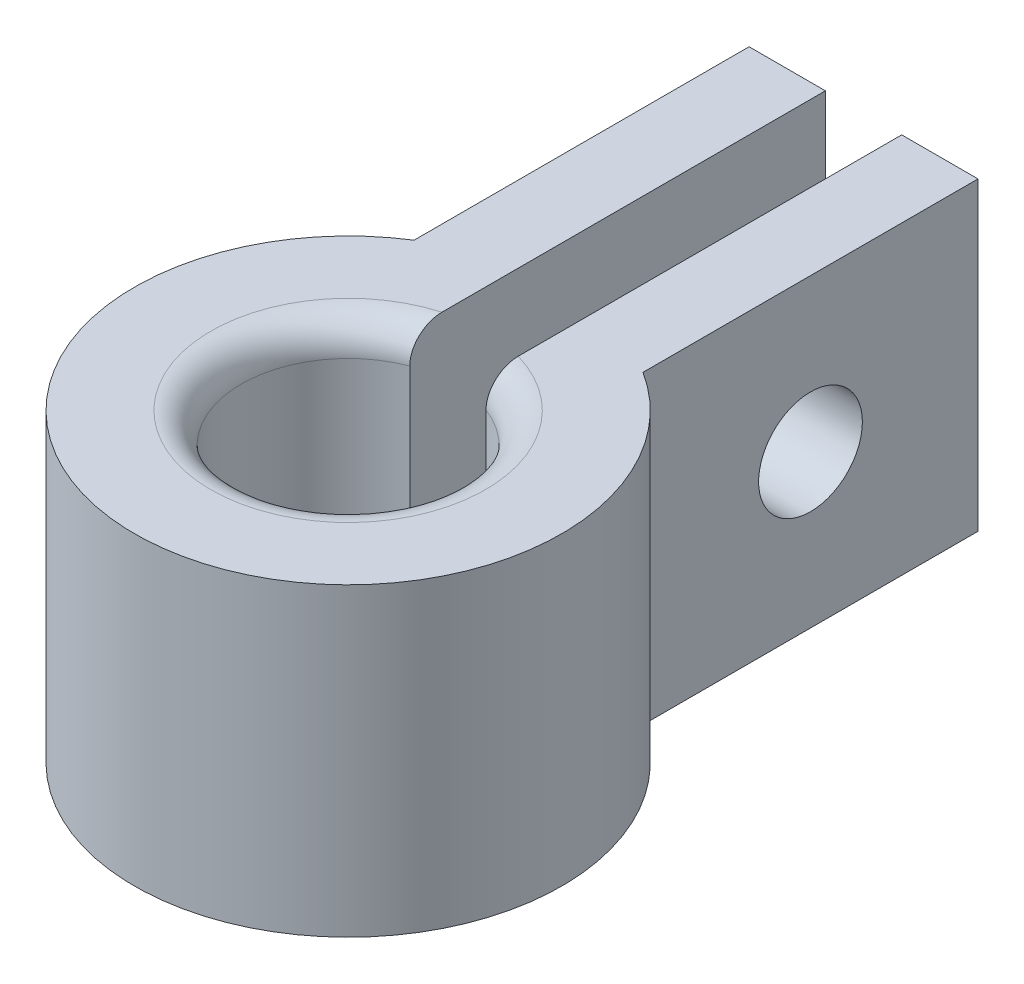
ISO-10303-21;
HEADER;
FILE_DESCRIPTION(('STEP AP214'),'2;1');
FILE_NAME('part.step','',(''),(''),'','','');
FILE_SCHEMA(('AUTOMOTIVE_DESIGN { 1 0 10303 214 1 1 1 1 }'));
ENDSEC;
DATA;
#1=APPLICATION_CONTEXT('core data for automotive mechanical design processes');
#2=APPLICATION_PROTOCOL_DEFINITION('international standard','automotive_design',2000,#1);
#3=PRODUCT_CONTEXT('',#1,'mechanical');
#4=PRODUCT('Part','Part','',(#3));
#5=PRODUCT_RELATED_PRODUCT_CATEGORY('part','',(#4));
#6=PRODUCT_DEFINITION_FORMATION('','',#4);
#7=PRODUCT_DEFINITION_CONTEXT('part definition',#1,'design');
#8=PRODUCT_DEFINITION('design','',#6,#7);
#9=PRODUCT_DEFINITION_SHAPE('','',#8);
#10=(LENGTH_UNIT() NAMED_UNIT(*) SI_UNIT(.MILLI.,.METRE.));
#11=(NAMED_UNIT(*) PLANE_ANGLE_UNIT() SI_UNIT($,.RADIAN.));
#12=(NAMED_UNIT(*) SI_UNIT($,.STERADIAN.) SOLID_ANGLE_UNIT());
#13=UNCERTAINTY_MEASURE_WITH_UNIT(LENGTH_MEASURE(1.E-05),#10,'distance_accuracy_value','');
#14=(GEOMETRIC_REPRESENTATION_CONTEXT(3) GLOBAL_UNCERTAINTY_ASSIGNED_CONTEXT((#13)) GLOBAL_UNIT_ASSIGNED_CONTEXT((#10,
#11,#12)) REPRESENTATION_CONTEXT('',''));
#15=CARTESIAN_POINT('',(0.,0.,0.));
#16=DIRECTION('',(0.,0.,1.));
#17=DIRECTION('',(1.,0.,0.));
#18=AXIS2_PLACEMENT_3D('',#15,#16,#17);
#19=CARTESIAN_POINT('',(15.,10.,0.));
#20=DIRECTION('',(0.,-1.,0.));
#21=DIRECTION('',(0.,0.,-1.));
#22=AXIS2_PLACEMENT_3D('',#19,#20,#21);
#23=CYLINDRICAL_SURFACE('',#22,3.5);
#24=DIRECTION('',(0.,-1.,0.));
#25=VECTOR('',#24,1.);
#26=CARTESIAN_POINT('',(13.75,10.,-3.26917420765551));
#27=LINE('',#26,#25);
#28=CARTESIAN_POINT('',(13.75,9.,-3.26917420765551));
#29=VERTEX_POINT('',#28);
#30=CARTESIAN_POINT('',(13.75,0.,-3.26917420765551));
#31=VERTEX_POINT('',#30);
#32=EDGE_CURVE('E124',#29,#31,#27,.T.);
#33=ORIENTED_EDGE('',*,*,#32,.F.);
#34=CARTESIAN_POINT('',(15.,9.,0.));
#35=DIRECTION('',(0.,1.,0.));
#36=DIRECTION('',(0.,0.,1.));
#37=AXIS2_PLACEMENT_3D('',#34,#35,#36);
#38=CIRCLE('',#37,3.5);
#39=CARTESIAN_POINT('',(16.25,9.,-3.26917420765551));
#40=VERTEX_POINT('',#39);
#41=EDGE_CURVE('E46',#29,#40,#38,.T.);
#42=ORIENTED_EDGE('',*,*,#41,.T.);
#43=DIRECTION('',(0.,-1.,0.));
#44=VECTOR('',#43,1.);
#45=CARTESIAN_POINT('',(16.25,10.,-3.26917420765551));
#46=LINE('',#45,#44);
#47=CARTESIAN_POINT('',(16.25,0.,-3.26917420765551));
#48=VERTEX_POINT('',#47);
#49=EDGE_CURVE('E143',#40,#48,#46,.T.);
#50=ORIENTED_EDGE('',*,*,#49,.T.);
#51=CARTESIAN_POINT('',(15.,0.,0.));
#52=DIRECTION('',(0.,-1.,0.));
#53=DIRECTION('',(0.,0.,1.));
#54=AXIS2_PLACEMENT_3D('',#51,#52,#53);
#55=CIRCLE('',#54,3.5);
#56=EDGE_CURVE('E144',#48,#31,#55,.T.);
#57=ORIENTED_EDGE('',*,*,#56,.T.);
#58=EDGE_LOOP('',(#33,#42,#50,#57));
#59=FACE_BOUND('',#58,.T.);
#60=ADVANCED_FACE('F33',(#59),#23,.F.);
#61=CARTESIAN_POINT('',(13.75,10.,-3.26917420765551));
#62=DIRECTION('',(-1.,0.,0.));
#63=DIRECTION('',(0.,0.,1.));
#64=AXIS2_PLACEMENT_3D('',#61,#62,#63);
#65=PLANE('',#64);
#66=CARTESIAN_POINT('',(13.75,5.,-11.3991419328732));
#67=DIRECTION('',(-1.,0.,0.));
#68=DIRECTION('',(0.,0.,1.));
#69=AXIS2_PLACEMENT_3D('',#66,#67,#68);
#70=CIRCLE('',#69,1.7);
#71=CARTESIAN_POINT('',(13.75,5.,-9.69914193287319));
#72=VERTEX_POINT('',#71);
#73=EDGE_CURVE('E147',#72,#72,#70,.T.);
#74=ORIENTED_EDGE('',*,*,#73,.T.);
#75=EDGE_LOOP('',(#74));
#76=FACE_BOUND('',#75,.T.);
#77=DIRECTION('',(0.,0.,-1.));
#78=VECTOR('',#77,1.);
#79=CARTESIAN_POINT('',(13.75,10.,-3.26917420765551));
#80=LINE('',#79,#78);
#81=CARTESIAN_POINT('',(13.75,10.,-4.32290411644765));
#82=VERTEX_POINT('',#81);
#83=CARTESIAN_POINT('',(13.75,10.,-16.8874886569779));
#84=VERTEX_POINT('',#83);
#85=EDGE_CURVE('E106',#82,#84,#80,.T.);
#86=ORIENTED_EDGE('',*,*,#85,.F.);
#87=CARTESIAN_POINT('',(13.75,10.,-4.32290411644765));
#88=CARTESIAN_POINT('',(13.75,10.0000371726311,-4.26168850649478));
#89=CARTESIAN_POINT('',(13.75,9.99481471497901,-4.2004919890519));
#90=CARTESIAN_POINT('',(13.75,9.97423212357851,-4.07983071694326));
#91=CARTESIAN_POINT('',(13.75,9.9588728157396,-4.02036582160404));
#92=CARTESIAN_POINT('',(13.75,9.91838961831433,-3.90482695347765));
#93=CARTESIAN_POINT('',(13.75,9.89326169183152,-3.84875439366338));
#94=CARTESIAN_POINT('',(13.75,9.83387522841679,-3.74167775191016));
#95=CARTESIAN_POINT('',(13.75,9.79961872294156,-3.69067254575457));
#96=CARTESIAN_POINT('',(13.75,9.72316082915071,-3.59579043845732));
#97=CARTESIAN_POINT('',(13.75,9.68103742343316,-3.55185084147884));
#98=CARTESIAN_POINT('',(13.75,9.58968097770283,-3.47207058995911));
#99=CARTESIAN_POINT('',(13.75,9.54044791902879,-3.43622995667649));
#100=CARTESIAN_POINT('',(13.75,9.43867940309272,-3.37555742038712));
#101=CARTESIAN_POINT('',(13.75,9.3864013994994,-3.35029361195714));
#102=CARTESIAN_POINT('',(13.75,9.27818891048917,-3.30958652151111));
#103=CARTESIAN_POINT('',(13.75,9.22226040658363,-3.2941275981832));
#104=CARTESIAN_POINT('',(13.75,9.13814145641317,-3.27902048671216));
#105=CARTESIAN_POINT('',(13.75,9.11062545702522,-3.27533060162375));
#106=CARTESIAN_POINT('',(13.75,9.05541143328096,-3.27040872700991));
#107=CARTESIAN_POINT('',(13.75,9.0277136989979,-3.26917348165975));
#108=CARTESIAN_POINT('',(13.75,9.,-3.26917420765551));
#109=B_SPLINE_CURVE_WITH_KNOTS('',3,(#87,#88,#89,#90,#91,#92,#93,#94,#95,#96,#97,#98,#99,#100,
#101,#102,#103,#104,#105,#106,#107,#108),.UNSPECIFIED.,.F.,.F.,(4,2,2,2,2,2,2,2,2,2,4),(0.,
0.183399436540463,0.366783932281852,0.550244292641021,0.733663860124261,0.91535343742245,
1.09704349162429,1.27034414410628,1.4433676375176,1.5265603235968,1.60964258936562),.UNSPECIFIED.);
#110=EDGE_CURVE('E60',#82,#29,#109,.T.);
#111=ORIENTED_EDGE('',*,*,#110,.T.);
#112=ORIENTED_EDGE('',*,*,#32,.T.);
#113=DIRECTION('',(0.,0.,-1.));
#114=VECTOR('',#113,1.);
#115=CARTESIAN_POINT('',(13.75,0.,-3.26917420765551));
#116=LINE('',#115,#114);
#117=CARTESIAN_POINT('',(13.75,0.,-16.8874886569779));
#118=VERTEX_POINT('',#117);
#119=EDGE_CURVE('E121',#31,#118,#116,.T.);
#120=ORIENTED_EDGE('',*,*,#119,.T.);
#121=DIRECTION('',(0.,-1.,0.));
#122=VECTOR('',#121,1.);
#123=CARTESIAN_POINT('',(13.75,10.,-16.8874886569779));
#124=LINE('',#123,#122);
#125=EDGE_CURVE('E118',#84,#118,#124,.T.);
#126=ORIENTED_EDGE('',*,*,#125,.F.);
#127=EDGE_LOOP('',(#86,#111,#112,#120,#126));
#128=FACE_BOUND('',#127,.T.);
#129=ADVANCED_FACE('F119',(#76,#128),#65,.F.);
#130=CARTESIAN_POINT('',(13.75,10.,-16.8874886569779));
#131=DIRECTION('',(0.,0.,1.));
#132=DIRECTION('',(1.,0.,0.));
#133=AXIS2_PLACEMENT_3D('',#130,#131,#132);
#134=PLANE('',#133);
#135=DIRECTION('',(-1.,0.,0.));
#136=VECTOR('',#135,1.);
#137=CARTESIAN_POINT('',(13.75,0.,-16.8874886569779));
#138=LINE('',#137,#136);
#139=CARTESIAN_POINT('',(11.25,0.,-16.8874886569779));
#140=VERTEX_POINT('',#139);
#141=EDGE_CURVE('E149',#118,#140,#138,.T.);
#142=ORIENTED_EDGE('',*,*,#141,.T.);
#143=DIRECTION('',(0.,-1.,0.));
#144=VECTOR('',#143,1.);
#145=CARTESIAN_POINT('',(11.25,10.,-16.8874886569779));
#146=LINE('',#145,#144);
#147=CARTESIAN_POINT('',(11.25,10.,-16.8874886569779));
#148=VERTEX_POINT('',#147);
#149=EDGE_CURVE('E125',#148,#140,#146,.T.);
#150=ORIENTED_EDGE('',*,*,#149,.F.);
#151=DIRECTION('',(-1.,0.,0.));
#152=VECTOR('',#151,1.);
#153=CARTESIAN_POINT('',(13.75,10.,-16.8874886569779));
#154=LINE('',#153,#152);
#155=EDGE_CURVE('E111',#84,#148,#154,.T.);
#156=ORIENTED_EDGE('',*,*,#155,.F.);
#157=ORIENTED_EDGE('',*,*,#125,.T.);
#158=EDGE_LOOP('',(#142,#150,#156,#157));
#159=FACE_BOUND('',#158,.T.);
#160=ADVANCED_FACE('F127',(#159),#134,.F.);
#161=CARTESIAN_POINT('',(11.25,10.,-16.8874886569779));
#162=DIRECTION('',(1.,0.,0.));
#163=DIRECTION('',(0.,0.,-1.));
#164=AXIS2_PLACEMENT_3D('',#161,#162,#163);
#165=PLANE('',#164);
#166=CARTESIAN_POINT('',(11.25,5.,-11.3991419328732));
#167=DIRECTION('',(1.,0.,0.));
#168=DIRECTION('',(0.,0.,-1.));
#169=AXIS2_PLACEMENT_3D('',#166,#167,#168);
#170=CIRCLE('',#169,1.7);
#171=CARTESIAN_POINT('',(11.25,5.,-13.0991419328732));
#172=VERTEX_POINT('',#171);
#173=EDGE_CURVE('E179',#172,#172,#170,.F.);
#174=ORIENTED_EDGE('',*,*,#173,.F.);
#175=EDGE_LOOP('',(#174));
#176=FACE_BOUND('',#175,.T.);
#177=DIRECTION('',(0.,0.,1.));
#178=VECTOR('',#177,1.);
#179=CARTESIAN_POINT('',(11.25,0.,-16.8874886569779));
#180=LINE('',#179,#178);
#181=CARTESIAN_POINT('',(11.25,0.,-5.91079520876845));
#182=VERTEX_POINT('',#181);
#183=EDGE_CURVE('E151',#140,#182,#180,.T.);
#184=ORIENTED_EDGE('',*,*,#183,.T.);
#185=DIRECTION('',(0.,-1.,0.));
#186=VECTOR('',#185,1.);
#187=CARTESIAN_POINT('',(11.25,10.,-5.91079520876845));
#188=LINE('',#187,#186);
#189=CARTESIAN_POINT('',(11.25,10.,-5.91079520876845));
#190=VERTEX_POINT('',#189);
#191=EDGE_CURVE('E171',#190,#182,#188,.T.);
#192=ORIENTED_EDGE('',*,*,#191,.F.);
#193=DIRECTION('',(0.,0.,1.));
#194=VECTOR('',#193,1.);
#195=CARTESIAN_POINT('',(11.25,10.,-16.8874886569779));
#196=LINE('',#195,#194);
#197=EDGE_CURVE('E130',#148,#190,#196,.T.);
#198=ORIENTED_EDGE('',*,*,#197,.F.);
#199=ORIENTED_EDGE('',*,*,#149,.T.);
#200=EDGE_LOOP('',(#184,#192,#198,#199));
#201=FACE_BOUND('',#200,.T.);
#202=ADVANCED_FACE('F213',(#176,#201),#165,.F.);
#203=CARTESIAN_POINT('',(15.,10.,0.));
#204=DIRECTION('',(0.,-1.,0.));
#205=DIRECTION('',(0.,0.,-1.));
#206=AXIS2_PLACEMENT_3D('',#203,#204,#205);
#207=CYLINDRICAL_SURFACE('',#206,6.99999999999999);
#208=CARTESIAN_POINT('',(15.,0.,0.));
#209=DIRECTION('',(0.,1.,0.));
#210=DIRECTION('',(0.,0.,1.));
#211=AXIS2_PLACEMENT_3D('',#208,#209,#210);
#212=CIRCLE('',#211,6.99999999999999);
#213=CARTESIAN_POINT('',(18.75,0.,-5.91079520876845));
#214=VERTEX_POINT('',#213);
#215=EDGE_CURVE('E153',#182,#214,#212,.T.);
#216=ORIENTED_EDGE('',*,*,#215,.T.);
#217=DIRECTION('',(0.,-1.,0.));
#218=VECTOR('',#217,1.);
#219=CARTESIAN_POINT('',(18.75,10.,-5.91079520876845));
#220=LINE('',#219,#218);
#221=CARTESIAN_POINT('',(18.75,10.,-5.91079520876845));
#222=VERTEX_POINT('',#221);
#223=EDGE_CURVE('E168',#222,#214,#220,.T.);
#224=ORIENTED_EDGE('',*,*,#223,.F.);
#225=CARTESIAN_POINT('',(15.,10.,0.));
#226=DIRECTION('',(0.,1.,0.));
#227=DIRECTION('',(0.,0.,1.));
#228=AXIS2_PLACEMENT_3D('',#225,#226,#227);
#229=CIRCLE('',#228,6.99999999999999);
#230=EDGE_CURVE('E132',#190,#222,#229,.T.);
#231=ORIENTED_EDGE('',*,*,#230,.F.);
#232=ORIENTED_EDGE('',*,*,#191,.T.);
#233=EDGE_LOOP('',(#216,#224,#231,#232));
#234=FACE_BOUND('',#233,.T.);
#235=ADVANCED_FACE('F218',(#234),#207,.T.);
#236=CARTESIAN_POINT('',(18.75,10.,-16.8874886569779));
#237=DIRECTION('',(-1.,0.,0.));
#238=DIRECTION('',(0.,0.,1.));
#239=AXIS2_PLACEMENT_3D('',#236,#237,#238);
#240=PLANE('',#239);
#241=CARTESIAN_POINT('',(18.75,5.,-11.3991419328732));
#242=DIRECTION('',(1.,0.,0.));
#243=DIRECTION('',(0.,0.,-1.));
#244=AXIS2_PLACEMENT_3D('',#241,#242,#243);
#245=CIRCLE('',#244,1.7);
#246=CARTESIAN_POINT('',(18.75,5.,-13.0991419328732));
#247=VERTEX_POINT('',#246);
#248=EDGE_CURVE('E239',#247,#247,#245,.T.);
#249=ORIENTED_EDGE('',*,*,#248,.F.);
#250=EDGE_LOOP('',(#249));
#251=FACE_BOUND('',#250,.T.);
#252=DIRECTION('',(0.,0.,-1.));
#253=VECTOR('',#252,1.);
#254=CARTESIAN_POINT('',(18.75,0.,-16.8874886569779));
#255=LINE('',#254,#253);
#256=CARTESIAN_POINT('',(18.75,0.,-16.8874886569779));
#257=VERTEX_POINT('',#256);
#258=EDGE_CURVE('E155',#214,#257,#255,.T.);
#259=ORIENTED_EDGE('',*,*,#258,.T.);
#260=DIRECTION('',(0.,-1.,0.));
#261=VECTOR('',#260,1.);
#262=CARTESIAN_POINT('',(18.75,10.,-16.8874886569779));
#263=LINE('',#262,#261);
#264=CARTESIAN_POINT('',(18.75,10.,-16.8874886569779));
#265=VERTEX_POINT('',#264);
#266=EDGE_CURVE('E165',#265,#257,#263,.T.);
#267=ORIENTED_EDGE('',*,*,#266,.F.);
#268=DIRECTION('',(0.,0.,-1.));
#269=VECTOR('',#268,1.);
#270=CARTESIAN_POINT('',(18.75,10.,-16.8874886569779));
#271=LINE('',#270,#269);
#272=EDGE_CURVE('E137',#222,#265,#271,.T.);
#273=ORIENTED_EDGE('',*,*,#272,.F.);
#274=ORIENTED_EDGE('',*,*,#223,.T.);
#275=EDGE_LOOP('',(#259,#267,#273,#274));
#276=FACE_BOUND('',#275,.T.);
#277=ADVANCED_FACE('F220',(#251,#276),#240,.F.);
#278=CARTESIAN_POINT('',(16.25,10.,-16.8874886569779));
#279=DIRECTION('',(0.,0.,1.));
#280=DIRECTION('',(1.,0.,0.));
#281=AXIS2_PLACEMENT_3D('',#278,#279,#280);
#282=PLANE('',#281);
#283=DIRECTION('',(-1.,0.,0.));
#284=VECTOR('',#283,1.);
#285=CARTESIAN_POINT('',(16.25,0.,-16.8874886569779));
#286=LINE('',#285,#284);
#287=CARTESIAN_POINT('',(16.25,0.,-16.8874886569779));
#288=VERTEX_POINT('',#287);
#289=EDGE_CURVE('E157',#257,#288,#286,.T.);
#290=ORIENTED_EDGE('',*,*,#289,.T.);
#291=DIRECTION('',(0.,-1.,0.));
#292=VECTOR('',#291,1.);
#293=CARTESIAN_POINT('',(16.25,10.,-16.8874886569779));
#294=LINE('',#293,#292);
#295=CARTESIAN_POINT('',(16.25,10.,-16.8874886569779));
#296=VERTEX_POINT('',#295);
#297=EDGE_CURVE('E162',#296,#288,#294,.T.);
#298=ORIENTED_EDGE('',*,*,#297,.F.);
#299=DIRECTION('',(-1.,0.,0.));
#300=VECTOR('',#299,1.);
#301=CARTESIAN_POINT('',(16.25,10.,-16.8874886569779));
#302=LINE('',#301,#300);
#303=EDGE_CURVE('E139',#265,#296,#302,.T.);
#304=ORIENTED_EDGE('',*,*,#303,.F.);
#305=ORIENTED_EDGE('',*,*,#266,.T.);
#306=EDGE_LOOP('',(#290,#298,#304,#305));
#307=FACE_BOUND('',#306,.T.);
#308=ADVANCED_FACE('F204',(#307),#282,.F.);
#309=CARTESIAN_POINT('',(16.25,10.,-3.26917420765551));
#310=DIRECTION('',(1.,0.,0.));
#311=DIRECTION('',(0.,0.,-1.));
#312=AXIS2_PLACEMENT_3D('',#309,#310,#311);
#313=PLANE('',#312);
#314=CARTESIAN_POINT('',(16.25,5.,-11.3991419328732));
#315=DIRECTION('',(1.,0.,0.));
#316=DIRECTION('',(0.,0.,-1.));
#317=AXIS2_PLACEMENT_3D('',#314,#315,#316);
#318=CIRCLE('',#317,1.7);
#319=CARTESIAN_POINT('',(16.25,5.,-13.0991419328732));
#320=VERTEX_POINT('',#319);
#321=EDGE_CURVE('E176',#320,#320,#318,.T.);
#322=ORIENTED_EDGE('',*,*,#321,.T.);
#323=EDGE_LOOP('',(#322));
#324=FACE_BOUND('',#323,.T.);
#325=ORIENTED_EDGE('',*,*,#49,.F.);
#326=CARTESIAN_POINT('',(16.25,9.,-3.2691742076555));
#327=CARTESIAN_POINT('',(16.25,9.02690601971004,-3.26917311434227));
#328=CARTESIAN_POINT('',(16.25,9.05379850249085,-3.27033759725731));
#329=CARTESIAN_POINT('',(16.25,9.1073779387073,-3.27497468550335));
#330=CARTESIAN_POINT('',(16.25,9.13406493562159,-3.27844678818846));
#331=CARTESIAN_POINT('',(16.25,9.21337310933712,-3.29225687038691));
#332=CARTESIAN_POINT('',(16.25,9.26544156676189,-3.30598901204183));
#333=CARTESIAN_POINT('',(16.25,9.36649706811549,-3.34193960290688));
#334=CARTESIAN_POINT('',(16.25,9.41548514105291,-3.36415520047248));
#335=CARTESIAN_POINT('',(16.25,9.50922118814031,-3.41624797268));
#336=CARTESIAN_POINT('',(16.25,9.55396722109909,-3.44612863195843));
#337=CARTESIAN_POINT('',(16.25,9.63953713668301,-3.51362802504034));
#338=CARTESIAN_POINT('',(16.25,9.68018896978564,-3.55146439745081));
#339=CARTESIAN_POINT('',(16.25,9.7550067426333,-3.63308404695194));
#340=CARTESIAN_POINT('',(16.25,9.78917070123607,-3.67686913356738));
#341=CARTESIAN_POINT('',(16.25,9.85213781550396,-3.77193857486059));
#342=CARTESIAN_POINT('',(16.25,9.88050159100349,-3.8235139953811));
#343=CARTESIAN_POINT('',(16.25,9.92853390054887,-3.93056204255974));
#344=CARTESIAN_POINT('',(16.25,9.94820329333237,-3.98603428370434));
#345=CARTESIAN_POINT('',(16.25,9.97545267173367,-4.08837905447667));
#346=CARTESIAN_POINT('',(16.25,9.98463800683883,-4.13483135754338));
#347=CARTESIAN_POINT('',(16.25,9.99691367541055,-4.22848479085124));
#348=CARTESIAN_POINT('',(16.25,10.0000102895646,-4.27568509877038));
#349=CARTESIAN_POINT('',(16.25,10.,-4.32290411644764));
#350=B_SPLINE_CURVE_WITH_KNOTS('',3,(#326,#327,#328,#329,#330,#331,#332,#333,#334,#335,#336,
#337,#338,#339,#340,#341,#342,#343,#344,#345,#346,#347,#348,#349),.UNSPECIFIED.,.F.,.F.,(4,2,2,
2,2,2,2,2,2,2,2,4),(0.,0.08066633179398,0.161315098598301,0.322020291002899,0.482671511151051,
0.643395895261895,0.809280519303936,0.9752157168342,1.15101461132206,1.32679613840327,
1.46846493522073,1.60998751985211),.UNSPECIFIED.);
#351=CARTESIAN_POINT('',(16.25,10.,-4.32290411644764));
#352=VERTEX_POINT('',#351);
#353=EDGE_CURVE('E11',#40,#352,#350,.T.);
#354=ORIENTED_EDGE('',*,*,#353,.T.);
#355=DIRECTION('',(0.,0.,1.));
#356=VECTOR('',#355,1.);
#357=CARTESIAN_POINT('',(16.25,10.,-3.26917420765551));
#358=LINE('',#357,#356);
#359=EDGE_CURVE('E141',#296,#352,#358,.T.);
#360=ORIENTED_EDGE('',*,*,#359,.F.);
#361=ORIENTED_EDGE('',*,*,#297,.T.);
#362=DIRECTION('',(0.,0.,1.));
#363=VECTOR('',#362,1.);
#364=CARTESIAN_POINT('',(16.25,0.,-3.26917420765551));
#365=LINE('',#364,#363);
#366=EDGE_CURVE('E115',#288,#48,#365,.T.);
#367=ORIENTED_EDGE('',*,*,#366,.T.);
#368=EDGE_LOOP('',(#325,#354,#360,#361,#367));
#369=FACE_BOUND('',#368,.T.);
#370=ADVANCED_FACE('F198',(#324,#369),#313,.F.);
#371=CARTESIAN_POINT('',(15.,10.,0.));
#372=DIRECTION('',(0.,1.,0.));
#373=DIRECTION('',(0.,0.,1.));
#374=AXIS2_PLACEMENT_3D('',#371,#372,#373);
#375=PLANE('',#374);
#376=ORIENTED_EDGE('',*,*,#359,.T.);
#377=CARTESIAN_POINT('',(15.,10.,0.));
#378=DIRECTION('',(0.,1.,0.));
#379=DIRECTION('',(0.,0.,1.));
#380=AXIS2_PLACEMENT_3D('',#377,#378,#379);
#381=CIRCLE('',#380,4.5);
#382=EDGE_CURVE('E114',#352,#82,#381,.F.);
#383=ORIENTED_EDGE('',*,*,#382,.T.);
#384=ORIENTED_EDGE('',*,*,#85,.T.);
#385=ORIENTED_EDGE('',*,*,#155,.T.);
#386=ORIENTED_EDGE('',*,*,#197,.T.);
#387=ORIENTED_EDGE('',*,*,#230,.T.);
#388=ORIENTED_EDGE('',*,*,#272,.T.);
#389=ORIENTED_EDGE('',*,*,#303,.T.);
#390=EDGE_LOOP('',(#376,#383,#384,#385,#386,#387,#388,#389));
#391=FACE_BOUND('',#390,.T.);
#392=ADVANCED_FACE('F109',(#391),#375,.T.);
#393=CARTESIAN_POINT('',(15.,0.,0.));
#394=DIRECTION('',(0.,1.,0.));
#395=DIRECTION('',(0.,0.,1.));
#396=AXIS2_PLACEMENT_3D('',#393,#394,#395);
#397=PLANE('',#396);
#398=ORIENTED_EDGE('',*,*,#56,.F.);
#399=ORIENTED_EDGE('',*,*,#366,.F.);
#400=ORIENTED_EDGE('',*,*,#289,.F.);
#401=ORIENTED_EDGE('',*,*,#258,.F.);
#402=ORIENTED_EDGE('',*,*,#215,.F.);
#403=ORIENTED_EDGE('',*,*,#183,.F.);
#404=ORIENTED_EDGE('',*,*,#141,.F.);
#405=ORIENTED_EDGE('',*,*,#119,.F.);
#406=EDGE_LOOP('',(#398,#399,#400,#401,#402,#403,#404,#405));
#407=FACE_BOUND('',#406,.T.);
#408=ADVANCED_FACE('F208',(#407),#397,.F.);
#409=CARTESIAN_POINT('',(6.44167388793151,5.,-11.3991419328732));
#410=DIRECTION('',(1.,0.,0.));
#411=DIRECTION('',(0.,0.,-1.));
#412=AXIS2_PLACEMENT_3D('',#409,#410,#411);
#413=CYLINDRICAL_SURFACE('',#412,1.7);
#414=ORIENTED_EDGE('',*,*,#248,.T.);
#415=EDGE_LOOP('',(#414));
#416=FACE_BOUND('',#415,.T.);
#417=ORIENTED_EDGE('',*,*,#321,.F.);
#418=EDGE_LOOP('',(#417));
#419=FACE_BOUND('',#418,.T.);
#420=ADVANCED_FACE('F248',(#416,#419),#413,.F.);
#421=ORIENTED_EDGE('',*,*,#173,.T.);
#422=EDGE_LOOP('',(#421));
#423=FACE_BOUND('',#422,.T.);
#424=ORIENTED_EDGE('',*,*,#73,.F.);
#425=EDGE_LOOP('',(#424));
#426=FACE_BOUND('',#425,.T.);
#427=ADVANCED_FACE('F246',(#423,#426),#413,.F.);
#428=CARTESIAN_POINT('',(15.,9.,0.));
#429=DIRECTION('',(0.,1.,0.));
#430=DIRECTION('',(0.,0.,1.));
#431=AXIS2_PLACEMENT_3D('',#428,#429,#430);
#432=TOROIDAL_SURFACE('',#431,4.5,1.);
#433=ORIENTED_EDGE('',*,*,#353,.F.);
#434=ORIENTED_EDGE('',*,*,#41,.F.);
#435=ORIENTED_EDGE('',*,*,#110,.F.);
#436=ORIENTED_EDGE('',*,*,#382,.F.);
#437=EDGE_LOOP('',(#433,#434,#435,#436));
#438=FACE_BOUND('',#437,.T.);
#439=ADVANCED_FACE('F35',(#438),#432,.T.);
#440=CLOSED_SHELL('',(#60,#129,#160,#202,#235,#277,#308,#370,#392,#408,#420,#427,#439));
#441=MANIFOLD_SOLID_BREP('B2',#440);
#442=ADVANCED_BREP_SHAPE_REPRESENTATION('',(#18,#441),#14);
#443=SHAPE_DEFINITION_REPRESENTATION(#9,#442);
ENDSEC;
END-ISO-10303-21;
